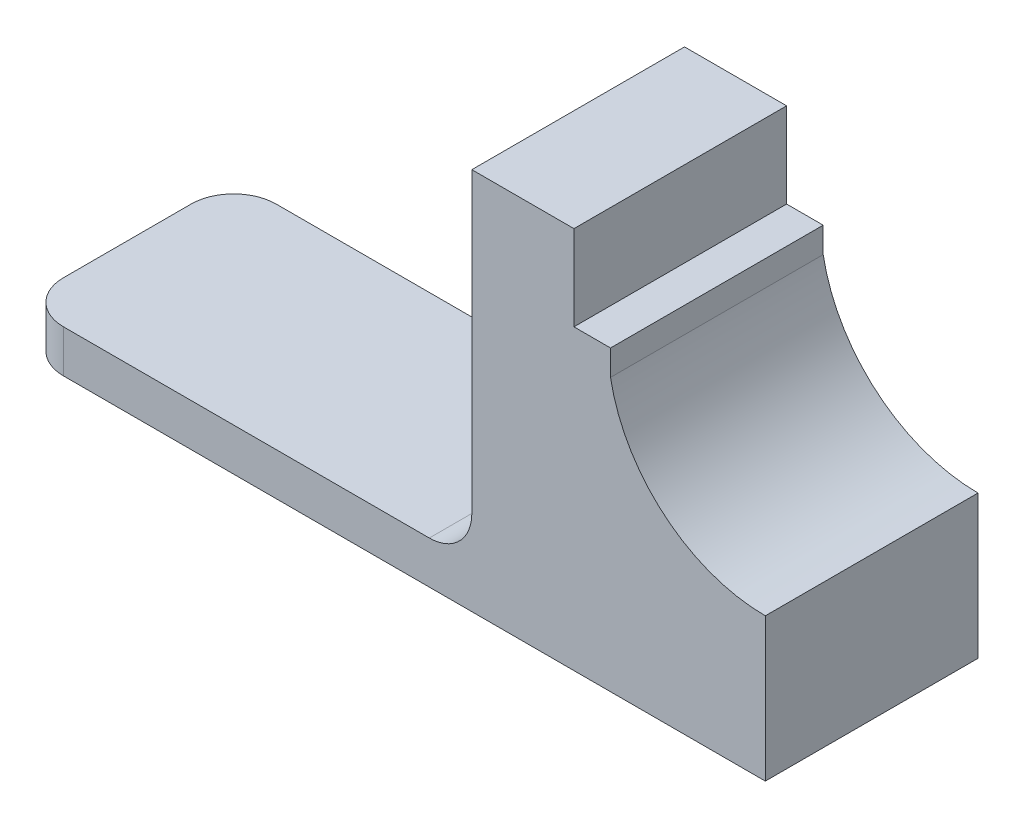
ISO-10303-21;
HEADER;
FILE_DESCRIPTION(('STEP AP214'),'2;1');
FILE_NAME('part.step','',(''),(''),'','','');
FILE_SCHEMA(('AUTOMOTIVE_DESIGN { 1 0 10303 214 1 1 1 1 }'));
ENDSEC;
DATA;
#1=APPLICATION_CONTEXT('core data for automotive mechanical design processes');
#2=APPLICATION_PROTOCOL_DEFINITION('international standard','automotive_design',2000,#1);
#3=PRODUCT_CONTEXT('',#1,'mechanical');
#4=PRODUCT('Part','Part','',(#3));
#5=PRODUCT_RELATED_PRODUCT_CATEGORY('part','',(#4));
#6=PRODUCT_DEFINITION_FORMATION('','',#4);
#7=PRODUCT_DEFINITION_CONTEXT('part definition',#1,'design');
#8=PRODUCT_DEFINITION('design','',#6,#7);
#9=PRODUCT_DEFINITION_SHAPE('','',#8);
#10=(LENGTH_UNIT() NAMED_UNIT(*) SI_UNIT(.MILLI.,.METRE.));
#11=(NAMED_UNIT(*) PLANE_ANGLE_UNIT() SI_UNIT($,.RADIAN.));
#12=(NAMED_UNIT(*) SI_UNIT($,.STERADIAN.) SOLID_ANGLE_UNIT());
#13=UNCERTAINTY_MEASURE_WITH_UNIT(LENGTH_MEASURE(1.E-05),#10,'distance_accuracy_value','');
#14=(GEOMETRIC_REPRESENTATION_CONTEXT(3) GLOBAL_UNCERTAINTY_ASSIGNED_CONTEXT((#13)) GLOBAL_UNIT_ASSIGNED_CONTEXT((#10,
#11,#12)) REPRESENTATION_CONTEXT('',''));
#15=CARTESIAN_POINT('',(0.,0.,0.));
#16=DIRECTION('',(0.,0.,1.));
#17=DIRECTION('',(1.,0.,0.));
#18=AXIS2_PLACEMENT_3D('',#15,#16,#17);
#19=CARTESIAN_POINT('',(-428.150553924179,246.136771999621,635.));
#20=DIRECTION('',(-1.,0.,0.));
#21=DIRECTION('',(0.,-1.,0.));
#22=AXIS2_PLACEMENT_3D('',#19,#20,#21);
#23=PLANE('',#22);
#24=DIRECTION('',(0.,1.,0.));
#25=VECTOR('',#24,1.);
#26=CARTESIAN_POINT('',(-428.150553924179,246.136771999621,0.));
#27=LINE('',#26,#25);
#28=CARTESIAN_POINT('',(-428.150553924179,-7.86322800037897,0.));
#29=VERTEX_POINT('',#28);
#30=CARTESIAN_POINT('',(-428.150553924179,246.136771999621,0.));
#31=VERTEX_POINT('',#30);
#32=EDGE_CURVE('E151',#29,#31,#27,.T.);
#33=ORIENTED_EDGE('',*,*,#32,.T.);
#34=DIRECTION('',(0.,0.,-1.));
#35=VECTOR('',#34,1.);
#36=CARTESIAN_POINT('',(-428.150553924179,246.136771999621,635.));
#37=LINE('',#36,#35);
#38=CARTESIAN_POINT('',(-428.150553924179,246.136771999621,635.));
#39=VERTEX_POINT('',#38);
#40=EDGE_CURVE('E131',#39,#31,#37,.T.);
#41=ORIENTED_EDGE('',*,*,#40,.F.);
#42=DIRECTION('',(0.,1.,0.));
#43=VECTOR('',#42,1.);
#44=CARTESIAN_POINT('',(-428.150553924179,246.136771999621,635.));
#45=LINE('',#44,#43);
#46=CARTESIAN_POINT('',(-428.150553924179,-7.86322800037897,635.));
#47=VERTEX_POINT('',#46);
#48=EDGE_CURVE('E138',#47,#39,#45,.T.);
#49=ORIENTED_EDGE('',*,*,#48,.F.);
#50=DIRECTION('',(0.,0.,-1.));
#51=VECTOR('',#50,1.);
#52=CARTESIAN_POINT('',(-428.150553924179,-7.86322800037897,635.));
#53=LINE('',#52,#51);
#54=EDGE_CURVE('E222',#47,#29,#53,.T.);
#55=ORIENTED_EDGE('',*,*,#54,.T.);
#56=EDGE_LOOP('',(#33,#41,#49,#55));
#57=FACE_BOUND('',#56,.T.);
#58=ADVANCED_FACE('F33',(#57),#23,.F.);
#59=CARTESIAN_POINT('',(-733.012661728365,246.136771999621,635.));
#60=DIRECTION('',(0.,-1.,0.));
#61=DIRECTION('',(0.,0.,-1.));
#62=AXIS2_PLACEMENT_3D('',#59,#60,#61);
#63=PLANE('',#62);
#64=DIRECTION('',(-1.,0.,0.));
#65=VECTOR('',#64,1.);
#66=CARTESIAN_POINT('',(-733.012661728365,246.136771999621,0.));
#67=LINE('',#66,#65);
#68=CARTESIAN_POINT('',(-733.012661728365,246.136771999621,0.));
#69=VERTEX_POINT('',#68);
#70=EDGE_CURVE('E209',#31,#69,#67,.T.);
#71=ORIENTED_EDGE('',*,*,#70,.T.);
#72=DIRECTION('',(0.,0.,-1.));
#73=VECTOR('',#72,1.);
#74=CARTESIAN_POINT('',(-733.012661728365,246.136771999621,635.));
#75=LINE('',#74,#73);
#76=CARTESIAN_POINT('',(-733.012661728365,246.136771999621,635.));
#77=VERTEX_POINT('',#76);
#78=EDGE_CURVE('E134',#77,#69,#75,.T.);
#79=ORIENTED_EDGE('',*,*,#78,.F.);
#80=DIRECTION('',(-1.,0.,0.));
#81=VECTOR('',#80,1.);
#82=CARTESIAN_POINT('',(-733.012661728365,246.136771999621,635.));
#83=LINE('',#82,#81);
#84=EDGE_CURVE('E127',#39,#77,#83,.T.);
#85=ORIENTED_EDGE('',*,*,#84,.F.);
#86=ORIENTED_EDGE('',*,*,#40,.T.);
#87=EDGE_LOOP('',(#71,#79,#85,#86));
#88=FACE_BOUND('',#87,.T.);
#89=ADVANCED_FACE('F129',(#88),#63,.F.);
#90=CARTESIAN_POINT('',(-733.012661728365,-642.863228000378,635.));
#91=DIRECTION('',(1.,0.,0.));
#92=DIRECTION('',(0.,0.,-1.));
#93=AXIS2_PLACEMENT_3D('',#90,#91,#92);
#94=PLANE('',#93);
#95=DIRECTION('',(0.,-1.,0.));
#96=VECTOR('',#95,1.);
#97=CARTESIAN_POINT('',(-733.012661728365,-642.863228000378,0.));
#98=LINE('',#97,#96);
#99=CARTESIAN_POINT('',(-733.012661728365,-642.863228000378,0.));
#100=VERTEX_POINT('',#99);
#101=EDGE_CURVE('E204',#69,#100,#98,.T.);
#102=ORIENTED_EDGE('',*,*,#101,.T.);
#103=DIRECTION('',(0.,0.,-1.));
#104=VECTOR('',#103,1.);
#105=CARTESIAN_POINT('',(-733.012661728365,-642.863228000378,635.));
#106=LINE('',#105,#104);
#107=CARTESIAN_POINT('',(-733.012661728365,-642.863228000378,635.));
#108=VERTEX_POINT('',#107);
#109=EDGE_CURVE('E157',#108,#100,#106,.T.);
#110=ORIENTED_EDGE('',*,*,#109,.F.);
#111=DIRECTION('',(0.,-1.,0.));
#112=VECTOR('',#111,1.);
#113=CARTESIAN_POINT('',(-733.012661728365,-642.863228000378,635.));
#114=LINE('',#113,#112);
#115=EDGE_CURVE('E137',#77,#108,#114,.T.);
#116=ORIENTED_EDGE('',*,*,#115,.F.);
#117=ORIENTED_EDGE('',*,*,#78,.T.);
#118=EDGE_LOOP('',(#102,#110,#116,#117));
#119=FACE_BOUND('',#118,.T.);
#120=ADVANCED_FACE('F252',(#119),#94,.F.);
#121=CARTESIAN_POINT('',(-860.012661728365,-642.863228000379,635.));
#122=DIRECTION('',(0.,0.,-1.));
#123=DIRECTION('',(-1.,0.,0.));
#124=AXIS2_PLACEMENT_3D('',#121,#122,#123);
#125=CYLINDRICAL_SURFACE('',#124,127.);
#126=CARTESIAN_POINT('',(-860.012661728365,-642.863228000379,0.));
#127=DIRECTION('',(0.,0.,-1.));
#128=DIRECTION('',(1.,0.,0.));
#129=AXIS2_PLACEMENT_3D('',#126,#127,#128);
#130=CIRCLE('',#129,127.);
#131=CARTESIAN_POINT('',(-860.012661728366,-769.863228000379,0.));
#132=VERTEX_POINT('',#131);
#133=EDGE_CURVE('E199',#100,#132,#130,.T.);
#134=ORIENTED_EDGE('',*,*,#133,.T.);
#135=DIRECTION('',(0.,0.,-1.));
#136=VECTOR('',#135,1.);
#137=CARTESIAN_POINT('',(-860.012661728366,-769.863228000379,635.));
#138=LINE('',#137,#136);
#139=CARTESIAN_POINT('',(-860.012661728366,-769.863228000379,635.));
#140=VERTEX_POINT('',#139);
#141=EDGE_CURVE('E184',#140,#132,#138,.T.);
#142=ORIENTED_EDGE('',*,*,#141,.F.);
#143=CARTESIAN_POINT('',(-860.012661728365,-642.863228000379,635.));
#144=DIRECTION('',(0.,0.,-1.));
#145=DIRECTION('',(1.,0.,0.));
#146=AXIS2_PLACEMENT_3D('',#143,#144,#145);
#147=CIRCLE('',#146,127.);
#148=EDGE_CURVE('E200',#108,#140,#147,.T.);
#149=ORIENTED_EDGE('',*,*,#148,.F.);
#150=ORIENTED_EDGE('',*,*,#109,.T.);
#151=EDGE_LOOP('',(#134,#142,#149,#150));
#152=FACE_BOUND('',#151,.T.);
#153=ADVANCED_FACE('F197',(#152),#125,.F.);
#154=CARTESIAN_POINT('',(-2079.21266172837,-769.863228000379,635.));
#155=DIRECTION('',(0.,-1.,0.));
#156=DIRECTION('',(0.,0.,-1.));
#157=AXIS2_PLACEMENT_3D('',#154,#155,#156);
#158=PLANE('',#157);
#159=DIRECTION('',(-1.,0.,0.));
#160=VECTOR('',#159,1.);
#161=CARTESIAN_POINT('',(-2079.21266172837,-769.863228000379,0.));
#162=LINE('',#161,#160);
#163=CARTESIAN_POINT('',(-1952.21266172836,-769.863228000379,0.));
#164=VERTEX_POINT('',#163);
#165=EDGE_CURVE('E205',#132,#164,#162,.T.);
#166=ORIENTED_EDGE('',*,*,#165,.T.);
#167=CARTESIAN_POINT('',(-1952.21266172836,-769.863228000379,127.));
#168=DIRECTION('',(0.,-1.,0.));
#169=DIRECTION('',(0.,0.,-1.));
#170=AXIS2_PLACEMENT_3D('',#167,#168,#169);
#171=CIRCLE('',#170,127.);
#172=CARTESIAN_POINT('',(-2079.21266172837,-769.863228000379,127.));
#173=VERTEX_POINT('',#172);
#174=EDGE_CURVE('E11',#164,#173,#171,.F.);
#175=ORIENTED_EDGE('',*,*,#174,.T.);
#176=DIRECTION('',(0.,0.,-1.));
#177=VECTOR('',#176,1.);
#178=CARTESIAN_POINT('',(-2079.21266172837,-769.863228000379,635.));
#179=LINE('',#178,#177);
#180=CARTESIAN_POINT('',(-2079.21266172837,-769.863228000379,508.));
#181=VERTEX_POINT('',#180);
#182=EDGE_CURVE('E177',#181,#173,#179,.T.);
#183=ORIENTED_EDGE('',*,*,#182,.F.);
#184=CARTESIAN_POINT('',(-1952.21266172836,-769.863228000379,508.));
#185=DIRECTION('',(0.,-1.,0.));
#186=DIRECTION('',(0.,0.,-1.));
#187=AXIS2_PLACEMENT_3D('',#184,#185,#186);
#188=CIRCLE('',#187,127.);
#189=CARTESIAN_POINT('',(-1952.21266172836,-769.863228000379,635.));
#190=VERTEX_POINT('',#189);
#191=EDGE_CURVE('E164',#181,#190,#188,.F.);
#192=ORIENTED_EDGE('',*,*,#191,.T.);
#193=DIRECTION('',(-1.,0.,0.));
#194=VECTOR('',#193,1.);
#195=CARTESIAN_POINT('',(-2079.21266172837,-769.863228000379,635.));
#196=LINE('',#195,#194);
#197=EDGE_CURVE('E254',#140,#190,#196,.T.);
#198=ORIENTED_EDGE('',*,*,#197,.F.);
#199=ORIENTED_EDGE('',*,*,#141,.T.);
#200=EDGE_LOOP('',(#166,#175,#183,#192,#198,#199));
#201=FACE_BOUND('',#200,.T.);
#202=ADVANCED_FACE('F264',(#201),#158,.F.);
#203=CARTESIAN_POINT('',(-2079.21266172837,-769.863228000379,635.));
#204=DIRECTION('',(1.,0.,0.));
#205=DIRECTION('',(0.,0.,-1.));
#206=AXIS2_PLACEMENT_3D('',#203,#204,#205);
#207=PLANE('',#206);
#208=ORIENTED_EDGE('',*,*,#182,.T.);
#209=DIRECTION('',(0.,-1.,0.));
#210=VECTOR('',#209,1.);
#211=CARTESIAN_POINT('',(-2079.21266172837,-769.863228000379,127.));
#212=LINE('',#211,#210);
#213=CARTESIAN_POINT('',(-2079.21266172837,-896.863228000379,127.));
#214=VERTEX_POINT('',#213);
#215=EDGE_CURVE('E166',#173,#214,#212,.T.);
#216=ORIENTED_EDGE('',*,*,#215,.T.);
#217=DIRECTION('',(0.,0.,-1.));
#218=VECTOR('',#217,1.);
#219=CARTESIAN_POINT('',(-2079.21266172837,-896.863228000379,635.));
#220=LINE('',#219,#218);
#221=CARTESIAN_POINT('',(-2079.21266172837,-896.863228000379,508.));
#222=VERTEX_POINT('',#221);
#223=EDGE_CURVE('E174',#222,#214,#220,.T.);
#224=ORIENTED_EDGE('',*,*,#223,.F.);
#225=DIRECTION('',(0.,-1.,0.));
#226=VECTOR('',#225,1.);
#227=CARTESIAN_POINT('',(-2079.21266172837,-769.863228000379,508.));
#228=LINE('',#227,#226);
#229=EDGE_CURVE('E162',#222,#181,#228,.F.);
#230=ORIENTED_EDGE('',*,*,#229,.T.);
#231=EDGE_LOOP('',(#208,#216,#224,#230));
#232=FACE_BOUND('',#231,.T.);
#233=ADVANCED_FACE('F173',(#232),#207,.F.);
#234=CARTESIAN_POINT('',(-2079.21266172837,-896.863228000379,635.));
#235=DIRECTION('',(0.,1.,0.));
#236=DIRECTION('',(0.,0.,1.));
#237=AXIS2_PLACEMENT_3D('',#234,#235,#236);
#238=PLANE('',#237);
#239=ORIENTED_EDGE('',*,*,#223,.T.);
#240=CARTESIAN_POINT('',(-1952.21266172836,-896.863228000379,127.));
#241=DIRECTION('',(0.,1.,0.));
#242=DIRECTION('',(0.,0.,1.));
#243=AXIS2_PLACEMENT_3D('',#240,#241,#242);
#244=CIRCLE('',#243,127.);
#245=CARTESIAN_POINT('',(-1952.21266172836,-896.863228000379,0.));
#246=VERTEX_POINT('',#245);
#247=EDGE_CURVE('E55',#214,#246,#244,.F.);
#248=ORIENTED_EDGE('',*,*,#247,.T.);
#249=DIRECTION('',(1.,0.,0.));
#250=VECTOR('',#249,1.);
#251=CARTESIAN_POINT('',(-2079.21266172837,-896.863228000379,0.));
#252=LINE('',#251,#250);
#253=CARTESIAN_POINT('',(143.287338271635,-896.863228000379,0.));
#254=VERTEX_POINT('',#253);
#255=EDGE_CURVE('E207',#246,#254,#252,.T.);
#256=ORIENTED_EDGE('',*,*,#255,.T.);
#257=DIRECTION('',(0.,0.,-1.));
#258=VECTOR('',#257,1.);
#259=CARTESIAN_POINT('',(143.287338271635,-896.863228000379,635.));
#260=LINE('',#259,#258);
#261=CARTESIAN_POINT('',(143.287338271635,-896.863228000379,635.));
#262=VERTEX_POINT('',#261);
#263=EDGE_CURVE('E182',#262,#254,#260,.T.);
#264=ORIENTED_EDGE('',*,*,#263,.F.);
#265=DIRECTION('',(1.,0.,0.));
#266=VECTOR('',#265,1.);
#267=CARTESIAN_POINT('',(-2079.21266172837,-896.863228000379,635.));
#268=LINE('',#267,#266);
#269=CARTESIAN_POINT('',(-1952.21266172836,-896.863228000379,635.));
#270=VERTEX_POINT('',#269);
#271=EDGE_CURVE('E258',#270,#262,#268,.T.);
#272=ORIENTED_EDGE('',*,*,#271,.F.);
#273=CARTESIAN_POINT('',(-1952.21266172836,-896.863228000379,508.));
#274=DIRECTION('',(0.,1.,0.));
#275=DIRECTION('',(0.,0.,1.));
#276=AXIS2_PLACEMENT_3D('',#273,#274,#275);
#277=CIRCLE('',#276,127.);
#278=EDGE_CURVE('E155',#270,#222,#277,.F.);
#279=ORIENTED_EDGE('',*,*,#278,.T.);
#280=EDGE_LOOP('',(#239,#248,#256,#264,#272,#279));
#281=FACE_BOUND('',#280,.T.);
#282=ADVANCED_FACE('F180',(#281),#238,.F.);
#283=CARTESIAN_POINT('',(143.287338271635,-469.337946829636,635.));
#284=DIRECTION('',(-1.,0.,0.));
#285=DIRECTION('',(0.,-1.,0.));
#286=AXIS2_PLACEMENT_3D('',#283,#284,#285);
#287=PLANE('',#286);
#288=DIRECTION('',(0.,1.,0.));
#289=VECTOR('',#288,1.);
#290=CARTESIAN_POINT('',(143.287338271635,-469.337946829636,0.));
#291=LINE('',#290,#289);
#292=CARTESIAN_POINT('',(143.287338271635,-469.337946829636,0.));
#293=VERTEX_POINT('',#292);
#294=EDGE_CURVE('E214',#254,#293,#291,.T.);
#295=ORIENTED_EDGE('',*,*,#294,.T.);
#296=DIRECTION('',(0.,0.,-1.));
#297=VECTOR('',#296,1.);
#298=CARTESIAN_POINT('',(143.287338271635,-469.337946829636,635.));
#299=LINE('',#298,#297);
#300=CARTESIAN_POINT('',(143.287338271635,-469.337946829636,635.));
#301=VERTEX_POINT('',#300);
#302=EDGE_CURVE('E187',#301,#293,#299,.T.);
#303=ORIENTED_EDGE('',*,*,#302,.F.);
#304=DIRECTION('',(0.,1.,0.));
#305=VECTOR('',#304,1.);
#306=CARTESIAN_POINT('',(143.287338271635,-469.337946829636,635.));
#307=LINE('',#306,#305);
#308=EDGE_CURVE('E260',#262,#301,#307,.T.);
#309=ORIENTED_EDGE('',*,*,#308,.F.);
#310=ORIENTED_EDGE('',*,*,#263,.T.);
#311=EDGE_LOOP('',(#295,#303,#309,#310));
#312=FACE_BOUND('',#311,.T.);
#313=ADVANCED_FACE('F262',(#312),#287,.F.);
#314=CARTESIAN_POINT('',(143.287338271634,0.562053170364313,635.));
#315=DIRECTION('',(0.,0.,-1.));
#316=DIRECTION('',(-1.,0.,0.));
#317=AXIS2_PLACEMENT_3D('',#314,#315,#316);
#318=CYLINDRICAL_SURFACE('',#317,469.9);
#319=CARTESIAN_POINT('',(143.287338271634,0.562053170364313,0.));
#320=DIRECTION('',(0.,0.,-1.));
#321=DIRECTION('',(1.,0.,0.));
#322=AXIS2_PLACEMENT_3D('',#319,#320,#321);
#323=CIRCLE('',#322,469.9);
#324=CARTESIAN_POINT('',(-318.929679791064,-84.0632280003788,0.));
#325=VERTEX_POINT('',#324);
#326=EDGE_CURVE('E216',#293,#325,#323,.T.);
#327=ORIENTED_EDGE('',*,*,#326,.T.);
#328=DIRECTION('',(0.,0.,-1.));
#329=VECTOR('',#328,1.);
#330=CARTESIAN_POINT('',(-318.929679791064,-84.0632280003788,635.));
#331=LINE('',#330,#329);
#332=CARTESIAN_POINT('',(-318.929679791064,-84.0632280003788,635.));
#333=VERTEX_POINT('',#332);
#334=EDGE_CURVE('E227',#333,#325,#331,.T.);
#335=ORIENTED_EDGE('',*,*,#334,.F.);
#336=CARTESIAN_POINT('',(143.287338271634,0.562053170364313,635.));
#337=DIRECTION('',(0.,0.,-1.));
#338=DIRECTION('',(1.,0.,0.));
#339=AXIS2_PLACEMENT_3D('',#336,#337,#338);
#340=CIRCLE('',#339,469.9);
#341=EDGE_CURVE('E236',#301,#333,#340,.T.);
#342=ORIENTED_EDGE('',*,*,#341,.F.);
#343=ORIENTED_EDGE('',*,*,#302,.T.);
#344=EDGE_LOOP('',(#327,#335,#342,#343));
#345=FACE_BOUND('',#344,.T.);
#346=ADVANCED_FACE('F234',(#345),#318,.F.);
#347=CARTESIAN_POINT('',(-318.929679791064,-84.063228000379,635.));
#348=DIRECTION('',(-1.,0.,0.));
#349=DIRECTION('',(0.,0.,1.));
#350=AXIS2_PLACEMENT_3D('',#347,#348,#349);
#351=PLANE('',#350);
#352=DIRECTION('',(0.,1.,0.));
#353=VECTOR('',#352,1.);
#354=CARTESIAN_POINT('',(-318.929679791064,-84.063228000379,0.));
#355=LINE('',#354,#353);
#356=CARTESIAN_POINT('',(-318.929679791064,-7.86322800038226,0.));
#357=VERTEX_POINT('',#356);
#358=EDGE_CURVE('E218',#325,#357,#355,.T.);
#359=ORIENTED_EDGE('',*,*,#358,.T.);
#360=DIRECTION('',(0.,0.,-1.));
#361=VECTOR('',#360,1.);
#362=CARTESIAN_POINT('',(-318.929679791064,-7.86322800038226,635.));
#363=LINE('',#362,#361);
#364=CARTESIAN_POINT('',(-318.929679791064,-7.86322800038226,635.));
#365=VERTEX_POINT('',#364);
#366=EDGE_CURVE('E224',#365,#357,#363,.T.);
#367=ORIENTED_EDGE('',*,*,#366,.F.);
#368=DIRECTION('',(0.,1.,0.));
#369=VECTOR('',#368,1.);
#370=CARTESIAN_POINT('',(-318.929679791064,-84.063228000379,635.));
#371=LINE('',#370,#369);
#372=EDGE_CURVE('E247',#333,#365,#371,.T.);
#373=ORIENTED_EDGE('',*,*,#372,.F.);
#374=ORIENTED_EDGE('',*,*,#334,.T.);
#375=EDGE_LOOP('',(#359,#367,#373,#374));
#376=FACE_BOUND('',#375,.T.);
#377=ADVANCED_FACE('F243',(#376),#351,.F.);
#378=CARTESIAN_POINT('',(-428.150553924179,-7.86322800037897,635.));
#379=DIRECTION('',(0.,-1.,0.));
#380=DIRECTION('',(0.,0.,-1.));
#381=AXIS2_PLACEMENT_3D('',#378,#379,#380);
#382=PLANE('',#381);
#383=DIRECTION('',(-1.,0.,0.));
#384=VECTOR('',#383,1.);
#385=CARTESIAN_POINT('',(-428.150553924179,-7.86322800037897,0.));
#386=LINE('',#385,#384);
#387=EDGE_CURVE('E148',#357,#29,#386,.T.);
#388=ORIENTED_EDGE('',*,*,#387,.T.);
#389=ORIENTED_EDGE('',*,*,#54,.F.);
#390=DIRECTION('',(-1.,4.27190489751563E-13,0.));
#391=VECTOR('',#390,1.);
#392=CARTESIAN_POINT('',(-318.929679791064,-7.86322800038226,635.));
#393=LINE('',#392,#391);
#394=EDGE_CURVE('E144',#365,#47,#393,.T.);
#395=ORIENTED_EDGE('',*,*,#394,.F.);
#396=ORIENTED_EDGE('',*,*,#366,.T.);
#397=EDGE_LOOP('',(#388,#389,#395,#396));
#398=FACE_BOUND('',#397,.T.);
#399=ADVANCED_FACE('F246',(#398),#382,.F.);
#400=CARTESIAN_POINT('',(143.287338271634,0.562053170364313,635.));
#401=DIRECTION('',(0.,0.,1.));
#402=DIRECTION('',(1.,0.,0.));
#403=AXIS2_PLACEMENT_3D('',#400,#401,#402);
#404=PLANE('',#403);
#405=ORIENTED_EDGE('',*,*,#197,.T.);
#406=DIRECTION('',(0.,-1.,0.));
#407=VECTOR('',#406,1.);
#408=CARTESIAN_POINT('',(-1952.21266172836,-896.863228000379,635.));
#409=LINE('',#408,#407);
#410=EDGE_CURVE('E152',#190,#270,#409,.T.);
#411=ORIENTED_EDGE('',*,*,#410,.T.);
#412=ORIENTED_EDGE('',*,*,#271,.T.);
#413=ORIENTED_EDGE('',*,*,#308,.T.);
#414=ORIENTED_EDGE('',*,*,#341,.T.);
#415=ORIENTED_EDGE('',*,*,#372,.T.);
#416=ORIENTED_EDGE('',*,*,#394,.T.);
#417=ORIENTED_EDGE('',*,*,#48,.T.);
#418=ORIENTED_EDGE('',*,*,#84,.T.);
#419=ORIENTED_EDGE('',*,*,#115,.T.);
#420=ORIENTED_EDGE('',*,*,#148,.T.);
#421=EDGE_LOOP('',(#405,#411,#412,#413,#414,#415,#416,#417,#418,#419,#420));
#422=FACE_BOUND('',#421,.T.);
#423=ADVANCED_FACE('F142',(#422),#404,.T.);
#424=CARTESIAN_POINT('',(143.287338271634,0.562053170364313,0.));
#425=DIRECTION('',(0.,0.,1.));
#426=DIRECTION('',(1.,0.,0.));
#427=AXIS2_PLACEMENT_3D('',#424,#425,#426);
#428=PLANE('',#427);
#429=ORIENTED_EDGE('',*,*,#255,.F.);
#430=DIRECTION('',(0.,-1.,0.));
#431=VECTOR('',#430,1.);
#432=CARTESIAN_POINT('',(-1952.21266172836,0.562053170364313,0.));
#433=LINE('',#432,#431);
#434=EDGE_CURVE('E41',#246,#164,#433,.F.);
#435=ORIENTED_EDGE('',*,*,#434,.T.);
#436=ORIENTED_EDGE('',*,*,#165,.F.);
#437=ORIENTED_EDGE('',*,*,#133,.F.);
#438=ORIENTED_EDGE('',*,*,#101,.F.);
#439=ORIENTED_EDGE('',*,*,#70,.F.);
#440=ORIENTED_EDGE('',*,*,#32,.F.);
#441=ORIENTED_EDGE('',*,*,#387,.F.);
#442=ORIENTED_EDGE('',*,*,#358,.F.);
#443=ORIENTED_EDGE('',*,*,#326,.F.);
#444=ORIENTED_EDGE('',*,*,#294,.F.);
#445=EDGE_LOOP('',(#429,#435,#436,#437,#438,#439,#440,#441,#442,#443,#444));
#446=FACE_BOUND('',#445,.T.);
#447=ADVANCED_FACE('F203',(#446),#428,.F.);
#448=CARTESIAN_POINT('',(-1952.21266172836,0.562053170364313,508.));
#449=DIRECTION('',(0.,1.,0.));
#450=DIRECTION('',(0.,0.,1.));
#451=AXIS2_PLACEMENT_3D('',#448,#449,#450);
#452=CYLINDRICAL_SURFACE('',#451,127.);
#453=ORIENTED_EDGE('',*,*,#191,.F.);
#454=ORIENTED_EDGE('',*,*,#229,.F.);
#455=ORIENTED_EDGE('',*,*,#278,.F.);
#456=ORIENTED_EDGE('',*,*,#410,.F.);
#457=EDGE_LOOP('',(#453,#454,#455,#456));
#458=FACE_BOUND('',#457,.T.);
#459=ADVANCED_FACE('F269',(#458),#452,.T.);
#460=CARTESIAN_POINT('',(-1952.21266172836,-769.863228000379,127.));
#461=DIRECTION('',(0.,-1.,0.));
#462=DIRECTION('',(0.,0.,-1.));
#463=AXIS2_PLACEMENT_3D('',#460,#461,#462);
#464=CYLINDRICAL_SURFACE('',#463,127.);
#465=ORIENTED_EDGE('',*,*,#174,.F.);
#466=ORIENTED_EDGE('',*,*,#434,.F.);
#467=ORIENTED_EDGE('',*,*,#247,.F.);
#468=ORIENTED_EDGE('',*,*,#215,.F.);
#469=EDGE_LOOP('',(#465,#466,#467,#468));
#470=FACE_BOUND('',#469,.T.);
#471=ADVANCED_FACE('F35',(#470),#464,.T.);
#472=CLOSED_SHELL('',(#58,#89,#120,#153,#202,#233,#282,#313,#346,#377,#399,#423,#447,#459,#471));
#473=MANIFOLD_SOLID_BREP('B2',#472);
#474=ADVANCED_BREP_SHAPE_REPRESENTATION('',(#18,#473),#14);
#475=SHAPE_DEFINITION_REPRESENTATION(#9,#474);
ENDSEC;
END-ISO-10303-21;
